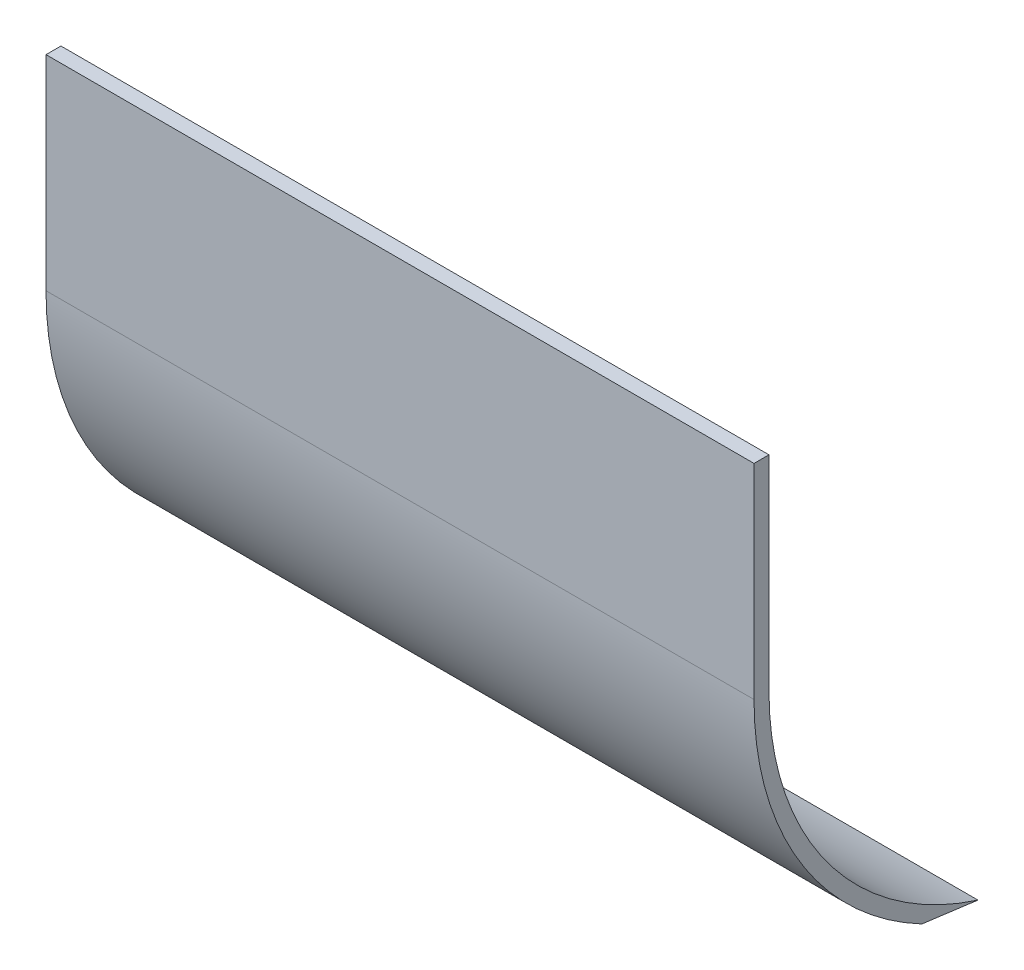
ISO-10303-21;
HEADER;
FILE_DESCRIPTION(('STEP AP214'),'2;1');
FILE_NAME('part.step','',(''),(''),'','','');
FILE_SCHEMA(('AUTOMOTIVE_DESIGN { 1 0 10303 214 1 1 1 1 }'));
ENDSEC;
DATA;
#1=APPLICATION_CONTEXT('core data for automotive mechanical design processes');
#2=APPLICATION_PROTOCOL_DEFINITION('international standard','automotive_design',2000,#1);
#3=PRODUCT_CONTEXT('',#1,'mechanical');
#4=PRODUCT('Part','Part','',(#3));
#5=PRODUCT_RELATED_PRODUCT_CATEGORY('part','',(#4));
#6=PRODUCT_DEFINITION_FORMATION('','',#4);
#7=PRODUCT_DEFINITION_CONTEXT('part definition',#1,'design');
#8=PRODUCT_DEFINITION('design','',#6,#7);
#9=PRODUCT_DEFINITION_SHAPE('','',#8);
#10=(LENGTH_UNIT() NAMED_UNIT(*) SI_UNIT(.MILLI.,.METRE.));
#11=(NAMED_UNIT(*) PLANE_ANGLE_UNIT() SI_UNIT($,.RADIAN.));
#12=(NAMED_UNIT(*) SI_UNIT($,.STERADIAN.) SOLID_ANGLE_UNIT());
#13=UNCERTAINTY_MEASURE_WITH_UNIT(LENGTH_MEASURE(1.E-05),#10,'distance_accuracy_value','');
#14=(GEOMETRIC_REPRESENTATION_CONTEXT(3) GLOBAL_UNCERTAINTY_ASSIGNED_CONTEXT((#13)) GLOBAL_UNIT_ASSIGNED_CONTEXT((#10,
#11,#12)) REPRESENTATION_CONTEXT('',''));
#15=CARTESIAN_POINT('',(0.,0.,0.));
#16=DIRECTION('',(0.,0.,1.));
#17=DIRECTION('',(1.,0.,0.));
#18=AXIS2_PLACEMENT_3D('',#15,#16,#17);
#19=CARTESIAN_POINT('',(50.,0.,0.));
#20=DIRECTION('',(-1.,0.,0.));
#21=DIRECTION('',(0.,0.,-1.));
#22=AXIS2_PLACEMENT_3D('',#19,#20,#21);
#23=CYLINDRICAL_SURFACE('',#22,44.45);
#24=CARTESIAN_POINT('',(-50.,0.,0.));
#25=DIRECTION('',(-1.,0.,0.));
#26=DIRECTION('',(0.,0.,-1.));
#27=AXIS2_PLACEMENT_3D('',#24,#25,#26);
#28=CIRCLE('',#27,44.45);
#29=CARTESIAN_POINT('',(-50.,-39.3112994705029,20.7466680202012));
#30=VERTEX_POINT('',#29);
#31=CARTESIAN_POINT('',(-50.,0.,44.45));
#32=VERTEX_POINT('',#31);
#33=EDGE_CURVE('E118',#30,#32,#28,.T.);
#34=ORIENTED_EDGE('',*,*,#33,.F.);
#35=DIRECTION('',(-1.,0.,0.));
#36=VECTOR('',#35,1.);
#37=CARTESIAN_POINT('',(50.,-39.3112994705029,20.7466680202012));
#38=LINE('',#37,#36);
#39=CARTESIAN_POINT('',(50.,-39.3112994705029,20.7466680202012));
#40=VERTEX_POINT('',#39);
#41=EDGE_CURVE('E117',#40,#30,#38,.T.);
#42=ORIENTED_EDGE('',*,*,#41,.F.);
#43=CARTESIAN_POINT('',(50.,0.,0.));
#44=DIRECTION('',(-1.,0.,0.));
#45=DIRECTION('',(0.,0.,-1.));
#46=AXIS2_PLACEMENT_3D('',#43,#44,#45);
#47=CIRCLE('',#46,44.45);
#48=CARTESIAN_POINT('',(50.,0.,44.45));
#49=VERTEX_POINT('',#48);
#50=EDGE_CURVE('E130',#40,#49,#47,.T.);
#51=ORIENTED_EDGE('',*,*,#50,.T.);
#52=DIRECTION('',(-1.,0.,0.));
#53=VECTOR('',#52,1.);
#54=CARTESIAN_POINT('',(50.,0.,44.45));
#55=LINE('',#54,#53);
#56=EDGE_CURVE('E11',#49,#32,#55,.T.);
#57=ORIENTED_EDGE('',*,*,#56,.T.);
#58=EDGE_LOOP('',(#34,#42,#51,#57));
#59=FACE_BOUND('',#58,.T.);
#60=ADVANCED_FACE('F35',(#59),#23,.T.);
#61=CARTESIAN_POINT('',(50.,0.,44.45));
#62=DIRECTION('',(0.,0.,-1.));
#63=DIRECTION('',(1.,0.,0.));
#64=AXIS2_PLACEMENT_3D('',#61,#62,#63);
#65=PLANE('',#64);
#66=DIRECTION('',(0.,1.,0.));
#67=VECTOR('',#66,1.);
#68=CARTESIAN_POINT('',(-50.,0.,44.45));
#69=LINE('',#68,#67);
#70=CARTESIAN_POINT('',(-50.,28.8781708122769,44.45));
#71=VERTEX_POINT('',#70);
#72=EDGE_CURVE('E120',#32,#71,#69,.T.);
#73=ORIENTED_EDGE('',*,*,#72,.F.);
#74=ORIENTED_EDGE('',*,*,#56,.F.);
#75=DIRECTION('',(0.,1.,0.));
#76=VECTOR('',#75,1.);
#77=CARTESIAN_POINT('',(50.,0.,44.45));
#78=LINE('',#77,#76);
#79=CARTESIAN_POINT('',(50.,28.8781708122769,44.45));
#80=VERTEX_POINT('',#79);
#81=EDGE_CURVE('E83',#49,#80,#78,.T.);
#82=ORIENTED_EDGE('',*,*,#81,.T.);
#83=DIRECTION('',(-1.,0.,0.));
#84=VECTOR('',#83,1.);
#85=CARTESIAN_POINT('',(50.,28.8781708122769,44.45));
#86=LINE('',#85,#84);
#87=EDGE_CURVE('E43',#80,#71,#86,.T.);
#88=ORIENTED_EDGE('',*,*,#87,.T.);
#89=EDGE_LOOP('',(#73,#74,#82,#88));
#90=FACE_BOUND('',#89,.T.);
#91=ADVANCED_FACE('F136',(#90),#65,.F.);
#92=CARTESIAN_POINT('',(50.,28.8781708122769,44.45));
#93=DIRECTION('',(0.,-1.,0.));
#94=DIRECTION('',(0.,0.,1.));
#95=AXIS2_PLACEMENT_3D('',#92,#93,#94);
#96=PLANE('',#95);
#97=DIRECTION('',(0.,0.,-1.));
#98=VECTOR('',#97,1.);
#99=CARTESIAN_POINT('',(-50.,28.8781708122769,44.45));
#100=LINE('',#99,#98);
#101=CARTESIAN_POINT('',(-50.,28.8781708122769,42.34));
#102=VERTEX_POINT('',#101);
#103=EDGE_CURVE('E123',#71,#102,#100,.T.);
#104=ORIENTED_EDGE('',*,*,#103,.F.);
#105=ORIENTED_EDGE('',*,*,#87,.F.);
#106=DIRECTION('',(0.,0.,-1.));
#107=VECTOR('',#106,1.);
#108=CARTESIAN_POINT('',(50.,28.8781708122769,44.45));
#109=LINE('',#108,#107);
#110=CARTESIAN_POINT('',(50.,28.8781708122769,42.34));
#111=VERTEX_POINT('',#110);
#112=EDGE_CURVE('E111',#80,#111,#109,.T.);
#113=ORIENTED_EDGE('',*,*,#112,.T.);
#114=DIRECTION('',(-1.,0.,0.));
#115=VECTOR('',#114,1.);
#116=CARTESIAN_POINT('',(50.,28.8781708122769,42.34));
#117=LINE('',#116,#115);
#118=EDGE_CURVE('E105',#111,#102,#117,.T.);
#119=ORIENTED_EDGE('',*,*,#118,.T.);
#120=EDGE_LOOP('',(#104,#105,#113,#119));
#121=FACE_BOUND('',#120,.T.);
#122=ADVANCED_FACE('F158',(#121),#96,.F.);
#123=CARTESIAN_POINT('',(50.,0.,42.34));
#124=DIRECTION('',(0.,0.,1.));
#125=DIRECTION('',(-1.,0.,0.));
#126=AXIS2_PLACEMENT_3D('',#123,#124,#125);
#127=PLANE('',#126);
#128=DIRECTION('',(0.,-1.,0.));
#129=VECTOR('',#128,1.);
#130=CARTESIAN_POINT('',(-50.,0.,42.34));
#131=LINE('',#130,#129);
#132=CARTESIAN_POINT('',(-50.,0.,42.34));
#133=VERTEX_POINT('',#132);
#134=EDGE_CURVE('E126',#102,#133,#131,.T.);
#135=ORIENTED_EDGE('',*,*,#134,.F.);
#136=ORIENTED_EDGE('',*,*,#118,.F.);
#137=DIRECTION('',(0.,-1.,0.));
#138=VECTOR('',#137,1.);
#139=CARTESIAN_POINT('',(50.,0.,42.34));
#140=LINE('',#139,#138);
#141=CARTESIAN_POINT('',(50.,0.,42.34));
#142=VERTEX_POINT('',#141);
#143=EDGE_CURVE('E95',#111,#142,#140,.T.);
#144=ORIENTED_EDGE('',*,*,#143,.T.);
#145=DIRECTION('',(-1.,0.,0.));
#146=VECTOR('',#145,1.);
#147=CARTESIAN_POINT('',(50.,0.,42.34));
#148=LINE('',#147,#146);
#149=EDGE_CURVE('E100',#142,#133,#148,.T.);
#150=ORIENTED_EDGE('',*,*,#149,.T.);
#151=EDGE_LOOP('',(#135,#136,#144,#150));
#152=FACE_BOUND('',#151,.T.);
#153=ADVANCED_FACE('F108',(#152),#127,.F.);
#154=CARTESIAN_POINT('',(50.,0.,0.));
#155=DIRECTION('',(-1.,0.,0.));
#156=DIRECTION('',(0.,0.,-1.));
#157=AXIS2_PLACEMENT_3D('',#154,#155,#156);
#158=CYLINDRICAL_SURFACE('',#157,42.34);
#159=CARTESIAN_POINT('',(-50.,0.,0.));
#160=DIRECTION('',(1.,0.,0.));
#161=DIRECTION('',(0.,0.,-1.));
#162=AXIS2_PLACEMENT_3D('',#159,#160,#161);
#163=CIRCLE('',#162,42.34);
#164=CARTESIAN_POINT('',(-50.,-40.354099313617,12.8149236668322));
#165=VERTEX_POINT('',#164);
#166=EDGE_CURVE('E102',#133,#165,#163,.T.);
#167=ORIENTED_EDGE('',*,*,#166,.F.);
#168=ORIENTED_EDGE('',*,*,#149,.F.);
#169=CARTESIAN_POINT('',(50.,0.,0.));
#170=DIRECTION('',(1.,0.,0.));
#171=DIRECTION('',(0.,0.,-1.));
#172=AXIS2_PLACEMENT_3D('',#169,#170,#171);
#173=CIRCLE('',#172,42.34);
#174=CARTESIAN_POINT('',(50.,-40.354099313617,12.8149236668322));
#175=VERTEX_POINT('',#174);
#176=EDGE_CURVE('E91',#142,#175,#173,.T.);
#177=ORIENTED_EDGE('',*,*,#176,.T.);
#178=DIRECTION('',(-1.,0.,0.));
#179=VECTOR('',#178,1.);
#180=CARTESIAN_POINT('',(50.,-40.354099313617,12.8149236668322));
#181=LINE('',#180,#179);
#182=EDGE_CURVE('E106',#175,#165,#181,.T.);
#183=ORIENTED_EDGE('',*,*,#182,.T.);
#184=EDGE_LOOP('',(#167,#168,#177,#183));
#185=FACE_BOUND('',#184,.T.);
#186=ADVANCED_FACE('F101',(#185),#158,.F.);
#187=CARTESIAN_POINT('',(50.,-40.354099313617,12.8149236668322));
#188=DIRECTION('',(0.,0.991468044171126,-0.130349980389265));
#189=DIRECTION('',(0.,-0.130349980389265,-0.991468044171126));
#190=AXIS2_PLACEMENT_3D('',#187,#188,#189);
#191=PLANE('',#190);
#192=DIRECTION('',(0.,0.130349980389265,0.991468044171126));
#193=VECTOR('',#192,1.);
#194=CARTESIAN_POINT('',(-50.,-40.354099313617,12.8149236668322));
#195=LINE('',#194,#193);
#196=EDGE_CURVE('E71',#165,#30,#195,.T.);
#197=ORIENTED_EDGE('',*,*,#196,.F.);
#198=ORIENTED_EDGE('',*,*,#182,.F.);
#199=DIRECTION('',(0.,0.130349980389265,0.991468044171126));
#200=VECTOR('',#199,1.);
#201=CARTESIAN_POINT('',(50.,-40.354099313617,12.8149236668322));
#202=LINE('',#201,#200);
#203=EDGE_CURVE('E51',#175,#40,#202,.T.);
#204=ORIENTED_EDGE('',*,*,#203,.T.);
#205=ORIENTED_EDGE('',*,*,#41,.T.);
#206=EDGE_LOOP('',(#197,#198,#204,#205));
#207=FACE_BOUND('',#206,.T.);
#208=ADVANCED_FACE('F144',(#207),#191,.F.);
#209=CARTESIAN_POINT('',(50.,0.,0.));
#210=DIRECTION('',(-1.,0.,0.));
#211=DIRECTION('',(0.,0.,-1.));
#212=AXIS2_PLACEMENT_3D('',#209,#210,#211);
#213=PLANE('',#212);
#214=ORIENTED_EDGE('',*,*,#50,.F.);
#215=ORIENTED_EDGE('',*,*,#203,.F.);
#216=ORIENTED_EDGE('',*,*,#176,.F.);
#217=ORIENTED_EDGE('',*,*,#143,.F.);
#218=ORIENTED_EDGE('',*,*,#112,.F.);
#219=ORIENTED_EDGE('',*,*,#81,.F.);
#220=EDGE_LOOP('',(#214,#215,#216,#217,#218,#219));
#221=FACE_BOUND('',#220,.T.);
#222=ADVANCED_FACE('F93',(#221),#213,.F.);
#223=CARTESIAN_POINT('',(-50.,0.,0.));
#224=DIRECTION('',(-1.,0.,0.));
#225=DIRECTION('',(0.,0.,-1.));
#226=AXIS2_PLACEMENT_3D('',#223,#224,#225);
#227=PLANE('',#226);
#228=ORIENTED_EDGE('',*,*,#33,.T.);
#229=ORIENTED_EDGE('',*,*,#72,.T.);
#230=ORIENTED_EDGE('',*,*,#103,.T.);
#231=ORIENTED_EDGE('',*,*,#134,.T.);
#232=ORIENTED_EDGE('',*,*,#166,.T.);
#233=ORIENTED_EDGE('',*,*,#196,.T.);
#234=EDGE_LOOP('',(#228,#229,#230,#231,#232,#233));
#235=FACE_BOUND('',#234,.T.);
#236=ADVANCED_FACE('F138',(#235),#227,.T.);
#237=CLOSED_SHELL('',(#60,#91,#122,#153,#186,#208,#222,#236));
#238=MANIFOLD_SOLID_BREP('B2',#237);
#239=ADVANCED_BREP_SHAPE_REPRESENTATION('',(#18,#238),#14);
#240=SHAPE_DEFINITION_REPRESENTATION(#9,#239);
ENDSEC;
END-ISO-10303-21;
